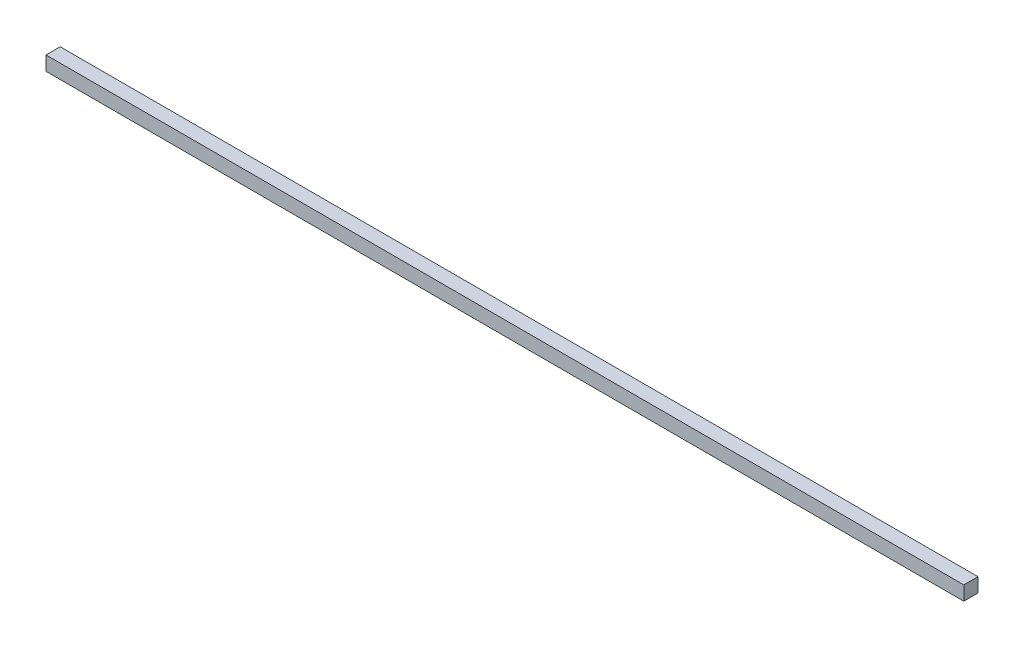
ISO-10303-21;
HEADER;
FILE_DESCRIPTION(('STEP AP214'),'2;1');
FILE_NAME('part.step','',(''),(''),'','','');
FILE_SCHEMA(('AUTOMOTIVE_DESIGN { 1 0 10303 214 1 1 1 1 }'));
ENDSEC;
DATA;
#1=APPLICATION_CONTEXT('core data for automotive mechanical design processes');
#2=APPLICATION_PROTOCOL_DEFINITION('international standard','automotive_design',2000,#1);
#3=PRODUCT_CONTEXT('',#1,'mechanical');
#4=PRODUCT('Part','Part','',(#3));
#5=PRODUCT_RELATED_PRODUCT_CATEGORY('part','',(#4));
#6=PRODUCT_DEFINITION_FORMATION('','',#4);
#7=PRODUCT_DEFINITION_CONTEXT('part definition',#1,'design');
#8=PRODUCT_DEFINITION('design','',#6,#7);
#9=PRODUCT_DEFINITION_SHAPE('','',#8);
#10=(LENGTH_UNIT() NAMED_UNIT(*) SI_UNIT(.MILLI.,.METRE.));
#11=(NAMED_UNIT(*) PLANE_ANGLE_UNIT() SI_UNIT($,.RADIAN.));
#12=(NAMED_UNIT(*) SI_UNIT($,.STERADIAN.) SOLID_ANGLE_UNIT());
#13=UNCERTAINTY_MEASURE_WITH_UNIT(LENGTH_MEASURE(1.E-05),#10,'distance_accuracy_value','');
#14=(GEOMETRIC_REPRESENTATION_CONTEXT(3) GLOBAL_UNCERTAINTY_ASSIGNED_CONTEXT((#13)) GLOBAL_UNIT_ASSIGNED_CONTEXT((#10,
#11,#12)) REPRESENTATION_CONTEXT('',''));
#15=CARTESIAN_POINT('',(0.,0.,0.));
#16=DIRECTION('',(0.,0.,1.));
#17=DIRECTION('',(1.,0.,0.));
#18=AXIS2_PLACEMENT_3D('',#15,#16,#17);
#19=CARTESIAN_POINT('',(-307.975,0.,0.));
#20=DIRECTION('',(0.,-1.,0.));
#21=DIRECTION('',(0.,0.,-1.));
#22=AXIS2_PLACEMENT_3D('',#19,#20,#21);
#23=PLANE('',#22);
#24=DIRECTION('',(0.,0.,-1.));
#25=VECTOR('',#24,1.);
#26=CARTESIAN_POINT('',(0.,0.,0.));
#27=LINE('',#26,#25);
#28=CARTESIAN_POINT('',(0.,0.,0.));
#29=VERTEX_POINT('',#28);
#30=CARTESIAN_POINT('',(0.,0.,-4.7625));
#31=VERTEX_POINT('',#30);
#32=EDGE_CURVE('E110',#29,#31,#27,.T.);
#33=ORIENTED_EDGE('',*,*,#32,.F.);
#34=DIRECTION('',(1.,0.,0.));
#35=VECTOR('',#34,1.);
#36=CARTESIAN_POINT('',(-307.975,0.,0.));
#37=LINE('',#36,#35);
#38=CARTESIAN_POINT('',(-307.975,0.,0.));
#39=VERTEX_POINT('',#38);
#40=EDGE_CURVE('E11',#39,#29,#37,.T.);
#41=ORIENTED_EDGE('',*,*,#40,.F.);
#42=DIRECTION('',(0.,0.,-1.));
#43=VECTOR('',#42,1.);
#44=CARTESIAN_POINT('',(-307.975,0.,0.));
#45=LINE('',#44,#43);
#46=CARTESIAN_POINT('',(-307.975,0.,-4.7625));
#47=VERTEX_POINT('',#46);
#48=EDGE_CURVE('E103',#39,#47,#45,.T.);
#49=ORIENTED_EDGE('',*,*,#48,.T.);
#50=DIRECTION('',(1.,0.,0.));
#51=VECTOR('',#50,1.);
#52=CARTESIAN_POINT('',(-307.975,0.,-4.7625));
#53=LINE('',#52,#51);
#54=EDGE_CURVE('E42',#47,#31,#53,.T.);
#55=ORIENTED_EDGE('',*,*,#54,.T.);
#56=EDGE_LOOP('',(#33,#41,#49,#55));
#57=FACE_BOUND('',#56,.T.);
#58=ADVANCED_FACE('F39',(#57),#23,.T.);
#59=CARTESIAN_POINT('',(-307.975,0.,0.));
#60=DIRECTION('',(0.,0.,-1.));
#61=DIRECTION('',(-1.,0.,0.));
#62=AXIS2_PLACEMENT_3D('',#59,#60,#61);
#63=PLANE('',#62);
#64=DIRECTION('',(0.,1.,0.));
#65=VECTOR('',#64,1.);
#66=CARTESIAN_POINT('',(0.,0.,0.));
#67=LINE('',#66,#65);
#68=CARTESIAN_POINT('',(0.,4.7625,0.));
#69=VERTEX_POINT('',#68);
#70=EDGE_CURVE('E73',#29,#69,#67,.T.);
#71=ORIENTED_EDGE('',*,*,#70,.T.);
#72=DIRECTION('',(1.,0.,0.));
#73=VECTOR('',#72,1.);
#74=CARTESIAN_POINT('',(-307.975,4.7625,0.));
#75=LINE('',#74,#73);
#76=CARTESIAN_POINT('',(-307.975,4.7625,0.));
#77=VERTEX_POINT('',#76);
#78=EDGE_CURVE('E49',#77,#69,#75,.T.);
#79=ORIENTED_EDGE('',*,*,#78,.F.);
#80=DIRECTION('',(0.,1.,0.));
#81=VECTOR('',#80,1.);
#82=CARTESIAN_POINT('',(-307.975,0.,0.));
#83=LINE('',#82,#81);
#84=EDGE_CURVE('E90',#39,#77,#83,.T.);
#85=ORIENTED_EDGE('',*,*,#84,.F.);
#86=ORIENTED_EDGE('',*,*,#40,.T.);
#87=EDGE_LOOP('',(#71,#79,#85,#86));
#88=FACE_BOUND('',#87,.T.);
#89=ADVANCED_FACE('F126',(#88),#63,.F.);
#90=CARTESIAN_POINT('',(-307.975,4.7625,0.));
#91=DIRECTION('',(0.,-1.,0.));
#92=DIRECTION('',(0.,0.,-1.));
#93=AXIS2_PLACEMENT_3D('',#90,#91,#92);
#94=PLANE('',#93);
#95=DIRECTION('',(0.,0.,-1.));
#96=VECTOR('',#95,1.);
#97=CARTESIAN_POINT('',(0.,4.7625,0.));
#98=LINE('',#97,#96);
#99=CARTESIAN_POINT('',(0.,4.7625,-4.7625));
#100=VERTEX_POINT('',#99);
#101=EDGE_CURVE('E98',#69,#100,#98,.T.);
#102=ORIENTED_EDGE('',*,*,#101,.T.);
#103=DIRECTION('',(1.,0.,0.));
#104=VECTOR('',#103,1.);
#105=CARTESIAN_POINT('',(-307.975,4.7625,-4.7625));
#106=LINE('',#105,#104);
#107=CARTESIAN_POINT('',(-307.975,4.7625,-4.7625));
#108=VERTEX_POINT('',#107);
#109=EDGE_CURVE('E95',#108,#100,#106,.T.);
#110=ORIENTED_EDGE('',*,*,#109,.F.);
#111=DIRECTION('',(0.,0.,-1.));
#112=VECTOR('',#111,1.);
#113=CARTESIAN_POINT('',(-307.975,4.7625,0.));
#114=LINE('',#113,#112);
#115=EDGE_CURVE('E85',#77,#108,#114,.T.);
#116=ORIENTED_EDGE('',*,*,#115,.F.);
#117=ORIENTED_EDGE('',*,*,#78,.T.);
#118=EDGE_LOOP('',(#102,#110,#116,#117));
#119=FACE_BOUND('',#118,.T.);
#120=ADVANCED_FACE('F96',(#119),#94,.F.);
#121=CARTESIAN_POINT('',(-307.975,0.,-4.7625));
#122=DIRECTION('',(0.,0.,-1.));
#123=DIRECTION('',(-1.,0.,0.));
#124=AXIS2_PLACEMENT_3D('',#121,#122,#123);
#125=PLANE('',#124);
#126=DIRECTION('',(0.,1.,0.));
#127=VECTOR('',#126,1.);
#128=CARTESIAN_POINT('',(0.,0.,-4.7625));
#129=LINE('',#128,#127);
#130=EDGE_CURVE('E114',#31,#100,#129,.T.);
#131=ORIENTED_EDGE('',*,*,#130,.F.);
#132=ORIENTED_EDGE('',*,*,#54,.F.);
#133=DIRECTION('',(0.,1.,0.));
#134=VECTOR('',#133,1.);
#135=CARTESIAN_POINT('',(-307.975,0.,-4.7625));
#136=LINE('',#135,#134);
#137=EDGE_CURVE('E89',#47,#108,#136,.T.);
#138=ORIENTED_EDGE('',*,*,#137,.T.);
#139=ORIENTED_EDGE('',*,*,#109,.T.);
#140=EDGE_LOOP('',(#131,#132,#138,#139));
#141=FACE_BOUND('',#140,.T.);
#142=ADVANCED_FACE('F101',(#141),#125,.T.);
#143=CARTESIAN_POINT('',(-307.975,0.,0.));
#144=DIRECTION('',(1.,0.,0.));
#145=DIRECTION('',(0.,0.,-1.));
#146=AXIS2_PLACEMENT_3D('',#143,#144,#145);
#147=PLANE('',#146);
#148=ORIENTED_EDGE('',*,*,#48,.F.);
#149=ORIENTED_EDGE('',*,*,#84,.T.);
#150=ORIENTED_EDGE('',*,*,#115,.T.);
#151=ORIENTED_EDGE('',*,*,#137,.F.);
#152=EDGE_LOOP('',(#148,#149,#150,#151));
#153=FACE_BOUND('',#152,.T.);
#154=ADVANCED_FACE('F88',(#153),#147,.F.);
#155=CARTESIAN_POINT('',(0.,0.,0.));
#156=DIRECTION('',(1.,0.,0.));
#157=DIRECTION('',(0.,0.,-1.));
#158=AXIS2_PLACEMENT_3D('',#155,#156,#157);
#159=PLANE('',#158);
#160=ORIENTED_EDGE('',*,*,#32,.T.);
#161=ORIENTED_EDGE('',*,*,#130,.T.);
#162=ORIENTED_EDGE('',*,*,#101,.F.);
#163=ORIENTED_EDGE('',*,*,#70,.F.);
#164=EDGE_LOOP('',(#160,#161,#162,#163));
#165=FACE_BOUND('',#164,.T.);
#166=ADVANCED_FACE('F123',(#165),#159,.T.);
#167=CLOSED_SHELL('',(#58,#89,#120,#142,#154,#166));
#168=MANIFOLD_SOLID_BREP('B2',#167);
#169=ADVANCED_BREP_SHAPE_REPRESENTATION('',(#18,#168),#14);
#170=SHAPE_DEFINITION_REPRESENTATION(#9,#169);
ENDSEC;
END-ISO-10303-21;
